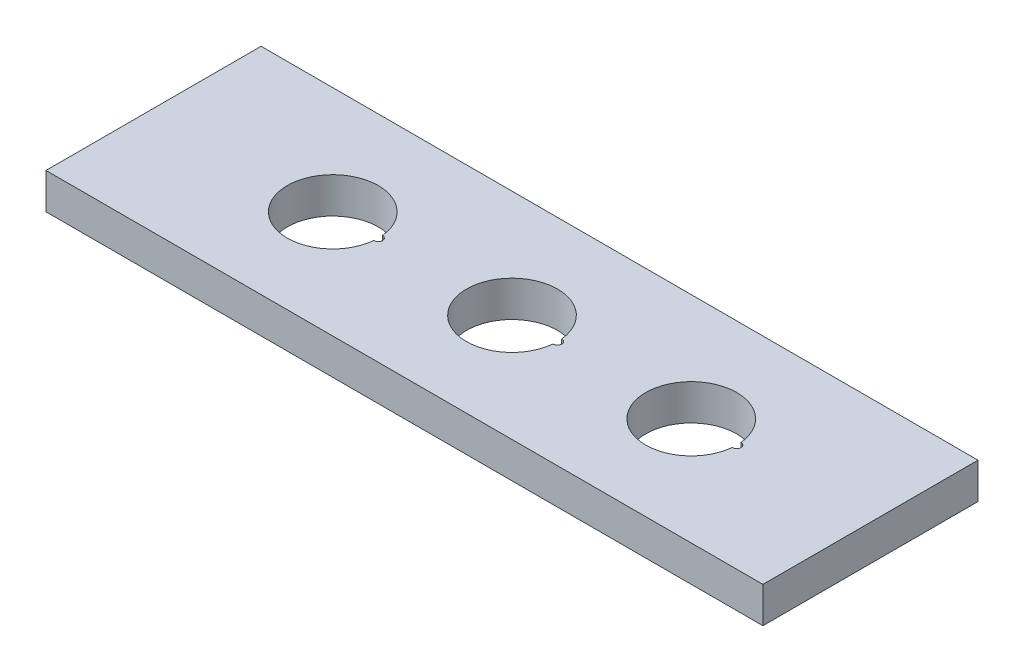
ISO-10303-21;
HEADER;
FILE_DESCRIPTION(('STEP AP214'),'2;1');
FILE_NAME('part.step','',(''),(''),'','','');
FILE_SCHEMA(('AUTOMOTIVE_DESIGN { 1 0 10303 214 1 1 1 1 }'));
ENDSEC;
DATA;
#1=APPLICATION_CONTEXT('core data for automotive mechanical design processes');
#2=APPLICATION_PROTOCOL_DEFINITION('international standard','automotive_design',2000,#1);
#3=PRODUCT_CONTEXT('',#1,'mechanical');
#4=PRODUCT('Part','Part','',(#3));
#5=PRODUCT_RELATED_PRODUCT_CATEGORY('part','',(#4));
#6=PRODUCT_DEFINITION_FORMATION('','',#4);
#7=PRODUCT_DEFINITION_CONTEXT('part definition',#1,'design');
#8=PRODUCT_DEFINITION('design','',#6,#7);
#9=PRODUCT_DEFINITION_SHAPE('','',#8);
#10=(LENGTH_UNIT() NAMED_UNIT(*) SI_UNIT(.MILLI.,.METRE.));
#11=(NAMED_UNIT(*) PLANE_ANGLE_UNIT() SI_UNIT($,.RADIAN.));
#12=(NAMED_UNIT(*) SI_UNIT($,.STERADIAN.) SOLID_ANGLE_UNIT());
#13=UNCERTAINTY_MEASURE_WITH_UNIT(LENGTH_MEASURE(1.E-05),#10,'distance_accuracy_value','');
#14=(GEOMETRIC_REPRESENTATION_CONTEXT(3) GLOBAL_UNCERTAINTY_ASSIGNED_CONTEXT((#13)) GLOBAL_UNIT_ASSIGNED_CONTEXT((#10,
#11,#12)) REPRESENTATION_CONTEXT('',''));
#15=CARTESIAN_POINT('',(0.,0.,0.));
#16=DIRECTION('',(0.,0.,1.));
#17=DIRECTION('',(1.,0.,0.));
#18=AXIS2_PLACEMENT_3D('',#15,#16,#17);
#19=CARTESIAN_POINT('',(0.,5.,0.));
#20=DIRECTION('',(0.,1.,0.));
#21=DIRECTION('',(0.,0.,1.));
#22=AXIS2_PLACEMENT_3D('',#19,#20,#21);
#23=PLANE('',#22);
#24=DIRECTION('',(0.,0.,1.));
#25=VECTOR('',#24,1.);
#26=CARTESIAN_POINT('',(-50.,5.,-15.));
#27=LINE('',#26,#25);
#28=CARTESIAN_POINT('',(-50.,5.,-15.));
#29=VERTEX_POINT('',#28);
#30=CARTESIAN_POINT('',(-50.,5.,15.));
#31=VERTEX_POINT('',#30);
#32=EDGE_CURVE('E160',#29,#31,#27,.T.);
#33=ORIENTED_EDGE('',*,*,#32,.T.);
#34=DIRECTION('',(1.,0.,0.));
#35=VECTOR('',#34,1.);
#36=CARTESIAN_POINT('',(-50.,5.,15.));
#37=LINE('',#36,#35);
#38=CARTESIAN_POINT('',(50.,5.,15.));
#39=VERTEX_POINT('',#38);
#40=EDGE_CURVE('E163',#31,#39,#37,.T.);
#41=ORIENTED_EDGE('',*,*,#40,.T.);
#42=DIRECTION('',(0.,0.,-1.));
#43=VECTOR('',#42,1.);
#44=CARTESIAN_POINT('',(50.,5.,-15.));
#45=LINE('',#44,#43);
#46=CARTESIAN_POINT('',(50.,5.,-15.));
#47=VERTEX_POINT('',#46);
#48=EDGE_CURVE('E166',#39,#47,#45,.T.);
#49=ORIENTED_EDGE('',*,*,#48,.T.);
#50=DIRECTION('',(-1.,0.,0.));
#51=VECTOR('',#50,1.);
#52=CARTESIAN_POINT('',(-50.,5.,-15.));
#53=LINE('',#52,#51);
#54=EDGE_CURVE('E168',#47,#29,#53,.T.);
#55=ORIENTED_EDGE('',*,*,#54,.T.);
#56=EDGE_LOOP('',(#33,#41,#49,#55));
#57=FACE_BOUND('',#56,.T.);
#58=CARTESIAN_POINT('',(31.35,5.,-1.74574066942157E-13));
#59=DIRECTION('',(0.,1.,0.));
#60=DIRECTION('',(0.,0.,-1.));
#61=AXIS2_PLACEMENT_3D('',#58,#59,#60);
#62=CIRCLE('',#61,0.6);
#63=CARTESIAN_POINT('',(31.3216535433071,5.,0.599330024604764));
#64=VERTEX_POINT('',#63);
#65=CARTESIAN_POINT('',(31.3216535433071,5.,-0.599330024605113));
#66=VERTEX_POINT('',#65);
#67=EDGE_CURVE('E146',#64,#66,#62,.T.);
#68=ORIENTED_EDGE('',*,*,#67,.F.);
#69=CARTESIAN_POINT('',(25.,5.,-1.74574066942157E-13));
#70=DIRECTION('',(0.,1.,0.));
#71=DIRECTION('',(0.,0.,1.));
#72=AXIS2_PLACEMENT_3D('',#69,#70,#71);
#73=CIRCLE('',#72,6.35);
#74=EDGE_CURVE('E143',#66,#64,#73,.T.);
#75=ORIENTED_EDGE('',*,*,#74,.F.);
#76=EDGE_LOOP('',(#68,#75));
#77=FACE_BOUND('',#76,.T.);
#78=CARTESIAN_POINT('',(6.35,5.,0.));
#79=DIRECTION('',(0.,1.,0.));
#80=DIRECTION('',(0.,0.,-1.));
#81=AXIS2_PLACEMENT_3D('',#78,#79,#80);
#82=CIRCLE('',#81,0.6);
#83=CARTESIAN_POINT('',(6.32165354330708,5.,0.599330024604939));
#84=VERTEX_POINT('',#83);
#85=CARTESIAN_POINT('',(6.32165354330708,5.,-0.599330024604939));
#86=VERTEX_POINT('',#85);
#87=EDGE_CURVE('E129',#84,#86,#82,.T.);
#88=ORIENTED_EDGE('',*,*,#87,.F.);
#89=CARTESIAN_POINT('',(0.,5.,0.));
#90=DIRECTION('',(0.,1.,0.));
#91=DIRECTION('',(0.,0.,1.));
#92=AXIS2_PLACEMENT_3D('',#89,#90,#91);
#93=CIRCLE('',#92,6.35);
#94=EDGE_CURVE('E126',#86,#84,#93,.T.);
#95=ORIENTED_EDGE('',*,*,#94,.F.);
#96=EDGE_LOOP('',(#88,#95));
#97=FACE_BOUND('',#96,.T.);
#98=CARTESIAN_POINT('',(-18.65,5.,1.74574066942157E-13));
#99=DIRECTION('',(0.,1.,0.));
#100=DIRECTION('',(0.,0.,-1.));
#101=AXIS2_PLACEMENT_3D('',#98,#99,#100);
#102=CIRCLE('',#101,0.6);
#103=CARTESIAN_POINT('',(-18.6783464566929,5.,0.599330024605113));
#104=VERTEX_POINT('',#103);
#105=CARTESIAN_POINT('',(-18.6783464566929,5.,-0.599330024604764));
#106=VERTEX_POINT('',#105);
#107=EDGE_CURVE('E109',#104,#106,#102,.T.);
#108=ORIENTED_EDGE('',*,*,#107,.F.);
#109=CARTESIAN_POINT('',(-25.,5.,1.74574066942157E-13));
#110=DIRECTION('',(0.,1.,0.));
#111=DIRECTION('',(0.,0.,1.));
#112=AXIS2_PLACEMENT_3D('',#109,#110,#111);
#113=CIRCLE('',#112,6.35);
#114=EDGE_CURVE('E115',#106,#104,#113,.T.);
#115=ORIENTED_EDGE('',*,*,#114,.F.);
#116=EDGE_LOOP('',(#108,#115));
#117=FACE_BOUND('',#116,.T.);
#118=ADVANCED_FACE('F33',(#57,#77,#97,#117),#23,.T.);
#119=CARTESIAN_POINT('',(0.,0.,0.));
#120=DIRECTION('',(0.,1.,0.));
#121=DIRECTION('',(0.,0.,1.));
#122=AXIS2_PLACEMENT_3D('',#119,#120,#121);
#123=PLANE('',#122);
#124=CARTESIAN_POINT('',(0.,0.,0.));
#125=DIRECTION('',(0.,1.,0.));
#126=DIRECTION('',(0.,0.,1.));
#127=AXIS2_PLACEMENT_3D('',#124,#125,#126);
#128=CIRCLE('',#127,6.35);
#129=CARTESIAN_POINT('',(6.32165354330708,0.,-0.599330024604939));
#130=VERTEX_POINT('',#129);
#131=CARTESIAN_POINT('',(6.32165354330708,0.,0.599330024604939));
#132=VERTEX_POINT('',#131);
#133=EDGE_CURVE('E125',#130,#132,#128,.T.);
#134=ORIENTED_EDGE('',*,*,#133,.T.);
#135=CARTESIAN_POINT('',(6.35,0.,0.));
#136=DIRECTION('',(0.,1.,0.));
#137=DIRECTION('',(0.,0.,-1.));
#138=AXIS2_PLACEMENT_3D('',#135,#136,#137);
#139=CIRCLE('',#138,0.6);
#140=EDGE_CURVE('E130',#132,#130,#139,.T.);
#141=ORIENTED_EDGE('',*,*,#140,.T.);
#142=EDGE_LOOP('',(#134,#141));
#143=FACE_BOUND('',#142,.T.);
#144=DIRECTION('',(0.,0.,1.));
#145=VECTOR('',#144,1.);
#146=CARTESIAN_POINT('',(-50.,0.,-15.));
#147=LINE('',#146,#145);
#148=CARTESIAN_POINT('',(-50.,0.,-15.));
#149=VERTEX_POINT('',#148);
#150=CARTESIAN_POINT('',(-50.,0.,15.));
#151=VERTEX_POINT('',#150);
#152=EDGE_CURVE('E159',#149,#151,#147,.T.);
#153=ORIENTED_EDGE('',*,*,#152,.F.);
#154=DIRECTION('',(-1.,0.,0.));
#155=VECTOR('',#154,1.);
#156=CARTESIAN_POINT('',(-50.,0.,-15.));
#157=LINE('',#156,#155);
#158=CARTESIAN_POINT('',(50.,0.,-15.));
#159=VERTEX_POINT('',#158);
#160=EDGE_CURVE('E164',#159,#149,#157,.T.);
#161=ORIENTED_EDGE('',*,*,#160,.F.);
#162=DIRECTION('',(0.,0.,-1.));
#163=VECTOR('',#162,1.);
#164=CARTESIAN_POINT('',(50.,0.,-15.));
#165=LINE('',#164,#163);
#166=CARTESIAN_POINT('',(50.,0.,15.));
#167=VERTEX_POINT('',#166);
#168=EDGE_CURVE('E175',#167,#159,#165,.T.);
#169=ORIENTED_EDGE('',*,*,#168,.F.);
#170=DIRECTION('',(1.,0.,0.));
#171=VECTOR('',#170,1.);
#172=CARTESIAN_POINT('',(-50.,0.,15.));
#173=LINE('',#172,#171);
#174=EDGE_CURVE('E173',#151,#167,#173,.T.);
#175=ORIENTED_EDGE('',*,*,#174,.F.);
#176=EDGE_LOOP('',(#153,#161,#169,#175));
#177=FACE_BOUND('',#176,.T.);
#178=CARTESIAN_POINT('',(25.,0.,-1.74574066942157E-13));
#179=DIRECTION('',(0.,1.,0.));
#180=DIRECTION('',(0.,0.,1.));
#181=AXIS2_PLACEMENT_3D('',#178,#179,#180);
#182=CIRCLE('',#181,6.35);
#183=CARTESIAN_POINT('',(31.3216535433071,0.,-0.599330024605113));
#184=VERTEX_POINT('',#183);
#185=CARTESIAN_POINT('',(31.3216535433071,0.,0.599330024604764));
#186=VERTEX_POINT('',#185);
#187=EDGE_CURVE('E142',#184,#186,#182,.T.);
#188=ORIENTED_EDGE('',*,*,#187,.T.);
#189=CARTESIAN_POINT('',(31.35,0.,-1.74574066942157E-13));
#190=DIRECTION('',(0.,1.,0.));
#191=DIRECTION('',(0.,0.,-1.));
#192=AXIS2_PLACEMENT_3D('',#189,#190,#191);
#193=CIRCLE('',#192,0.6);
#194=EDGE_CURVE('E147',#186,#184,#193,.T.);
#195=ORIENTED_EDGE('',*,*,#194,.T.);
#196=EDGE_LOOP('',(#188,#195));
#197=FACE_BOUND('',#196,.T.);
#198=CARTESIAN_POINT('',(-25.,0.,1.74574066942157E-13));
#199=DIRECTION('',(0.,1.,0.));
#200=DIRECTION('',(0.,0.,1.));
#201=AXIS2_PLACEMENT_3D('',#198,#199,#200);
#202=CIRCLE('',#201,6.35);
#203=CARTESIAN_POINT('',(-18.6783464566929,0.,-0.599330024604764));
#204=VERTEX_POINT('',#203);
#205=CARTESIAN_POINT('',(-18.6783464566929,0.,0.599330024605113));
#206=VERTEX_POINT('',#205);
#207=EDGE_CURVE('E55',#204,#206,#202,.T.);
#208=ORIENTED_EDGE('',*,*,#207,.T.);
#209=CARTESIAN_POINT('',(-18.65,0.,1.74574066942157E-13));
#210=DIRECTION('',(0.,1.,0.));
#211=DIRECTION('',(0.,0.,-1.));
#212=AXIS2_PLACEMENT_3D('',#209,#210,#211);
#213=CIRCLE('',#212,0.6);
#214=EDGE_CURVE('E119',#206,#204,#213,.T.);
#215=ORIENTED_EDGE('',*,*,#214,.T.);
#216=EDGE_LOOP('',(#208,#215));
#217=FACE_BOUND('',#216,.T.);
#218=ADVANCED_FACE('F193',(#143,#177,#197,#217),#123,.F.);
#219=CARTESIAN_POINT('',(-50.,5.,-15.));
#220=DIRECTION('',(1.,0.,0.));
#221=DIRECTION('',(0.,0.,-1.));
#222=AXIS2_PLACEMENT_3D('',#219,#220,#221);
#223=PLANE('',#222);
#224=ORIENTED_EDGE('',*,*,#152,.T.);
#225=DIRECTION('',(0.,-1.,0.));
#226=VECTOR('',#225,1.);
#227=CARTESIAN_POINT('',(-50.,5.,15.));
#228=LINE('',#227,#226);
#229=EDGE_CURVE('E11',#31,#151,#228,.T.);
#230=ORIENTED_EDGE('',*,*,#229,.F.);
#231=ORIENTED_EDGE('',*,*,#32,.F.);
#232=DIRECTION('',(0.,-1.,0.));
#233=VECTOR('',#232,1.);
#234=CARTESIAN_POINT('',(-50.,5.,-15.));
#235=LINE('',#234,#233);
#236=EDGE_CURVE('E170',#29,#149,#235,.T.);
#237=ORIENTED_EDGE('',*,*,#236,.T.);
#238=EDGE_LOOP('',(#224,#230,#231,#237));
#239=FACE_BOUND('',#238,.T.);
#240=ADVANCED_FACE('F35',(#239),#223,.F.);
#241=CARTESIAN_POINT('',(-50.,5.,15.));
#242=DIRECTION('',(0.,0.,-1.));
#243=DIRECTION('',(-1.,0.,0.));
#244=AXIS2_PLACEMENT_3D('',#241,#242,#243);
#245=PLANE('',#244);
#246=ORIENTED_EDGE('',*,*,#174,.T.);
#247=DIRECTION('',(0.,-1.,0.));
#248=VECTOR('',#247,1.);
#249=CARTESIAN_POINT('',(50.,5.,15.));
#250=LINE('',#249,#248);
#251=EDGE_CURVE('E41',#39,#167,#250,.T.);
#252=ORIENTED_EDGE('',*,*,#251,.F.);
#253=ORIENTED_EDGE('',*,*,#40,.F.);
#254=ORIENTED_EDGE('',*,*,#229,.T.);
#255=EDGE_LOOP('',(#246,#252,#253,#254));
#256=FACE_BOUND('',#255,.T.);
#257=ADVANCED_FACE('F204',(#256),#245,.F.);
#258=CARTESIAN_POINT('',(50.,5.,-15.));
#259=DIRECTION('',(-1.,0.,0.));
#260=DIRECTION('',(0.,0.,1.));
#261=AXIS2_PLACEMENT_3D('',#258,#259,#260);
#262=PLANE('',#261);
#263=ORIENTED_EDGE('',*,*,#168,.T.);
#264=DIRECTION('',(0.,-1.,0.));
#265=VECTOR('',#264,1.);
#266=CARTESIAN_POINT('',(50.,5.,-15.));
#267=LINE('',#266,#265);
#268=EDGE_CURVE('E180',#47,#159,#267,.T.);
#269=ORIENTED_EDGE('',*,*,#268,.F.);
#270=ORIENTED_EDGE('',*,*,#48,.F.);
#271=ORIENTED_EDGE('',*,*,#251,.T.);
#272=EDGE_LOOP('',(#263,#269,#270,#271));
#273=FACE_BOUND('',#272,.T.);
#274=ADVANCED_FACE('F187',(#273),#262,.F.);
#275=CARTESIAN_POINT('',(-50.,5.,-15.));
#276=DIRECTION('',(0.,0.,1.));
#277=DIRECTION('',(1.,0.,0.));
#278=AXIS2_PLACEMENT_3D('',#275,#276,#277);
#279=PLANE('',#278);
#280=ORIENTED_EDGE('',*,*,#160,.T.);
#281=ORIENTED_EDGE('',*,*,#236,.F.);
#282=ORIENTED_EDGE('',*,*,#54,.F.);
#283=ORIENTED_EDGE('',*,*,#268,.T.);
#284=EDGE_LOOP('',(#280,#281,#282,#283));
#285=FACE_BOUND('',#284,.T.);
#286=ADVANCED_FACE('F197',(#285),#279,.F.);
#287=CARTESIAN_POINT('',(25.,5.,-1.74574066942157E-13));
#288=DIRECTION('',(0.,-1.,0.));
#289=DIRECTION('',(0.,0.,-1.));
#290=AXIS2_PLACEMENT_3D('',#287,#288,#289);
#291=CYLINDRICAL_SURFACE('',#290,6.35);
#292=ORIENTED_EDGE('',*,*,#187,.F.);
#293=DIRECTION('',(0.,-1.,0.));
#294=VECTOR('',#293,1.);
#295=CARTESIAN_POINT('',(31.3216535433071,5.,-0.599330024605113));
#296=LINE('',#295,#294);
#297=EDGE_CURVE('E149',#66,#184,#296,.T.);
#298=ORIENTED_EDGE('',*,*,#297,.F.);
#299=ORIENTED_EDGE('',*,*,#74,.T.);
#300=DIRECTION('',(0.,-1.,0.));
#301=VECTOR('',#300,1.);
#302=CARTESIAN_POINT('',(31.3216535433071,5.,0.599330024604764));
#303=LINE('',#302,#301);
#304=EDGE_CURVE('E156',#64,#186,#303,.T.);
#305=ORIENTED_EDGE('',*,*,#304,.T.);
#306=EDGE_LOOP('',(#292,#298,#299,#305));
#307=FACE_BOUND('',#306,.T.);
#308=ADVANCED_FACE('F219',(#307),#291,.F.);
#309=CARTESIAN_POINT('',(31.35,5.,-1.74574066942157E-13));
#310=DIRECTION('',(0.,-1.,0.));
#311=DIRECTION('',(0.,0.,-1.));
#312=AXIS2_PLACEMENT_3D('',#309,#310,#311);
#313=CYLINDRICAL_SURFACE('',#312,0.6);
#314=ORIENTED_EDGE('',*,*,#194,.F.);
#315=ORIENTED_EDGE('',*,*,#304,.F.);
#316=ORIENTED_EDGE('',*,*,#67,.T.);
#317=ORIENTED_EDGE('',*,*,#297,.T.);
#318=EDGE_LOOP('',(#314,#315,#316,#317));
#319=FACE_BOUND('',#318,.T.);
#320=ADVANCED_FACE('F226',(#319),#313,.F.);
#321=CARTESIAN_POINT('',(0.,5.,0.));
#322=DIRECTION('',(0.,-1.,0.));
#323=DIRECTION('',(0.,0.,-1.));
#324=AXIS2_PLACEMENT_3D('',#321,#322,#323);
#325=CYLINDRICAL_SURFACE('',#324,6.35);
#326=ORIENTED_EDGE('',*,*,#133,.F.);
#327=DIRECTION('',(0.,-1.,0.));
#328=VECTOR('',#327,1.);
#329=CARTESIAN_POINT('',(6.32165354330708,5.,-0.599330024604939));
#330=LINE('',#329,#328);
#331=EDGE_CURVE('E132',#86,#130,#330,.T.);
#332=ORIENTED_EDGE('',*,*,#331,.F.);
#333=ORIENTED_EDGE('',*,*,#94,.T.);
#334=DIRECTION('',(0.,-1.,0.));
#335=VECTOR('',#334,1.);
#336=CARTESIAN_POINT('',(6.32165354330708,5.,0.599330024604939));
#337=LINE('',#336,#335);
#338=EDGE_CURVE('E139',#84,#132,#337,.T.);
#339=ORIENTED_EDGE('',*,*,#338,.T.);
#340=EDGE_LOOP('',(#326,#332,#333,#339));
#341=FACE_BOUND('',#340,.T.);
#342=ADVANCED_FACE('F231',(#341),#325,.F.);
#343=CARTESIAN_POINT('',(6.35,5.,0.));
#344=DIRECTION('',(0.,-1.,0.));
#345=DIRECTION('',(0.,0.,-1.));
#346=AXIS2_PLACEMENT_3D('',#343,#344,#345);
#347=CYLINDRICAL_SURFACE('',#346,0.6);
#348=ORIENTED_EDGE('',*,*,#140,.F.);
#349=ORIENTED_EDGE('',*,*,#338,.F.);
#350=ORIENTED_EDGE('',*,*,#87,.T.);
#351=ORIENTED_EDGE('',*,*,#331,.T.);
#352=EDGE_LOOP('',(#348,#349,#350,#351));
#353=FACE_BOUND('',#352,.T.);
#354=ADVANCED_FACE('F242',(#353),#347,.F.);
#355=CARTESIAN_POINT('',(-25.,5.,1.74574066942157E-13));
#356=DIRECTION('',(0.,-1.,0.));
#357=DIRECTION('',(0.,0.,-1.));
#358=AXIS2_PLACEMENT_3D('',#355,#356,#357);
#359=CYLINDRICAL_SURFACE('',#358,6.35);
#360=ORIENTED_EDGE('',*,*,#207,.F.);
#361=DIRECTION('',(0.,-1.,0.));
#362=VECTOR('',#361,1.);
#363=CARTESIAN_POINT('',(-18.6783464566929,5.,-0.599330024604764));
#364=LINE('',#363,#362);
#365=EDGE_CURVE('E111',#106,#204,#364,.T.);
#366=ORIENTED_EDGE('',*,*,#365,.F.);
#367=ORIENTED_EDGE('',*,*,#114,.T.);
#368=DIRECTION('',(0.,-1.,0.));
#369=VECTOR('',#368,1.);
#370=CARTESIAN_POINT('',(-18.6783464566929,5.,0.599330024605113));
#371=LINE('',#370,#369);
#372=EDGE_CURVE('E48',#104,#206,#371,.T.);
#373=ORIENTED_EDGE('',*,*,#372,.T.);
#374=EDGE_LOOP('',(#360,#366,#367,#373));
#375=FACE_BOUND('',#374,.T.);
#376=ADVANCED_FACE('F117',(#375),#359,.F.);
#377=CARTESIAN_POINT('',(-18.65,5.,1.74574066942157E-13));
#378=DIRECTION('',(0.,-1.,0.));
#379=DIRECTION('',(0.,0.,-1.));
#380=AXIS2_PLACEMENT_3D('',#377,#378,#379);
#381=CYLINDRICAL_SURFACE('',#380,0.6);
#382=ORIENTED_EDGE('',*,*,#214,.F.);
#383=ORIENTED_EDGE('',*,*,#372,.F.);
#384=ORIENTED_EDGE('',*,*,#107,.T.);
#385=ORIENTED_EDGE('',*,*,#365,.T.);
#386=EDGE_LOOP('',(#382,#383,#384,#385));
#387=FACE_BOUND('',#386,.T.);
#388=ADVANCED_FACE('F110',(#387),#381,.F.);
#389=CLOSED_SHELL('',(#118,#218,#240,#257,#274,#286,#308,#320,#342,#354,#376,#388));
#390=MANIFOLD_SOLID_BREP('B2',#389);
#391=ADVANCED_BREP_SHAPE_REPRESENTATION('',(#18,#390),#14);
#392=SHAPE_DEFINITION_REPRESENTATION(#9,#391);
ENDSEC;
END-ISO-10303-21;
